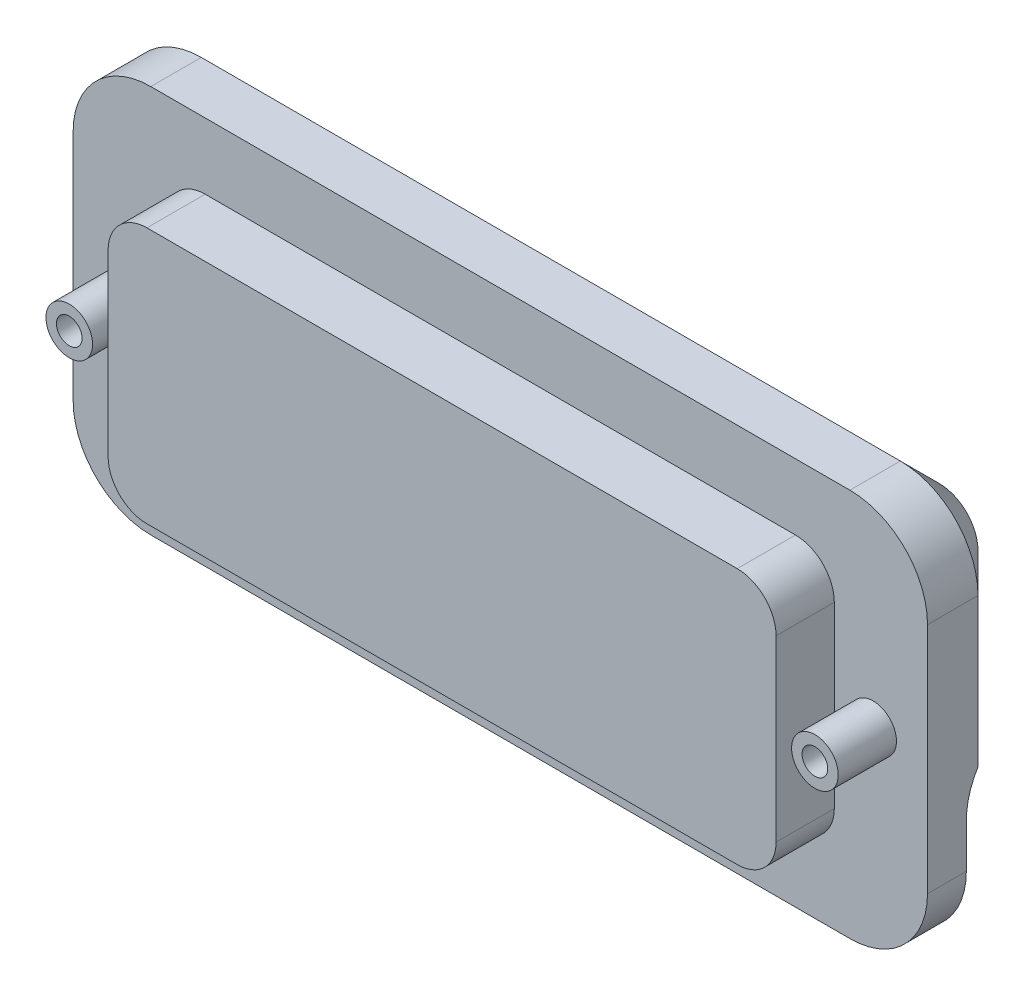
ISO-10303-21;
HEADER;
FILE_DESCRIPTION(('STEP AP214'),'2;1');
FILE_NAME('part.step','',(''),(''),'','','');
FILE_SCHEMA(('AUTOMOTIVE_DESIGN { 1 0 10303 214 1 1 1 1 }'));
ENDSEC;
DATA;
#1=APPLICATION_CONTEXT('core data for automotive mechanical design processes');
#2=APPLICATION_PROTOCOL_DEFINITION('international standard','automotive_design',2000,#1);
#3=PRODUCT_CONTEXT('',#1,'mechanical');
#4=PRODUCT('Part','Part','',(#3));
#5=PRODUCT_RELATED_PRODUCT_CATEGORY('part','',(#4));
#6=PRODUCT_DEFINITION_FORMATION('','',#4);
#7=PRODUCT_DEFINITION_CONTEXT('part definition',#1,'design');
#8=PRODUCT_DEFINITION('design','',#6,#7);
#9=PRODUCT_DEFINITION_SHAPE('','',#8);
#10=(LENGTH_UNIT() NAMED_UNIT(*) SI_UNIT(.MILLI.,.METRE.));
#11=(NAMED_UNIT(*) PLANE_ANGLE_UNIT() SI_UNIT($,.RADIAN.));
#12=(NAMED_UNIT(*) SI_UNIT($,.STERADIAN.) SOLID_ANGLE_UNIT());
#13=UNCERTAINTY_MEASURE_WITH_UNIT(LENGTH_MEASURE(1.E-05),#10,'distance_accuracy_value','');
#14=(GEOMETRIC_REPRESENTATION_CONTEXT(3) GLOBAL_UNCERTAINTY_ASSIGNED_CONTEXT((#13)) GLOBAL_UNIT_ASSIGNED_CONTEXT((#10,
#11,#12)) REPRESENTATION_CONTEXT('',''));
#15=CARTESIAN_POINT('',(0.,0.,0.));
#16=DIRECTION('',(0.,0.,1.));
#17=DIRECTION('',(1.,0.,0.));
#18=AXIS2_PLACEMENT_3D('',#15,#16,#17);
#19=CARTESIAN_POINT('',(0.,0.,0.));
#20=DIRECTION('',(0.,0.,1.));
#21=DIRECTION('',(1.,0.,0.));
#22=AXIS2_PLACEMENT_3D('',#19,#20,#21);
#23=PLANE('',#22);
#24=DIRECTION('',(0.,-1.,0.));
#25=VECTOR('',#24,1.);
#26=CARTESIAN_POINT('',(-55.,25.,0.));
#27=LINE('',#26,#25);
#28=CARTESIAN_POINT('',(-55.,-9.3674969975976,0.));
#29=VERTEX_POINT('',#28);
#30=CARTESIAN_POINT('',(-55.,-15.,0.));
#31=VERTEX_POINT('',#30);
#32=EDGE_CURVE('E292',#29,#31,#27,.T.);
#33=ORIENTED_EDGE('',*,*,#32,.F.);
#34=DIRECTION('',(1.,0.,0.));
#35=VECTOR('',#34,1.);
#36=CARTESIAN_POINT('',(0.,-9.3674969975976,0.));
#37=LINE('',#36,#35);
#38=CARTESIAN_POINT('',(55.,-9.3674969975976,0.));
#39=VERTEX_POINT('',#38);
#40=EDGE_CURVE('E347',#29,#39,#37,.T.);
#41=ORIENTED_EDGE('',*,*,#40,.T.);
#42=DIRECTION('',(0.,1.,0.));
#43=VECTOR('',#42,1.);
#44=CARTESIAN_POINT('',(55.,25.,0.));
#45=LINE('',#44,#43);
#46=CARTESIAN_POINT('',(55.,-15.,0.));
#47=VERTEX_POINT('',#46);
#48=EDGE_CURVE('E273',#47,#39,#45,.T.);
#49=ORIENTED_EDGE('',*,*,#48,.F.);
#50=CARTESIAN_POINT('',(45.,-15.,0.));
#51=DIRECTION('',(0.,0.,1.));
#52=DIRECTION('',(1.,0.,0.));
#53=AXIS2_PLACEMENT_3D('',#50,#51,#52);
#54=CIRCLE('',#53,10.);
#55=CARTESIAN_POINT('',(45.,-25.,0.));
#56=VERTEX_POINT('',#55);
#57=EDGE_CURVE('E316',#47,#56,#54,.F.);
#58=ORIENTED_EDGE('',*,*,#57,.T.);
#59=DIRECTION('',(1.,0.,0.));
#60=VECTOR('',#59,1.);
#61=CARTESIAN_POINT('',(-55.,-25.,0.));
#62=LINE('',#61,#60);
#63=CARTESIAN_POINT('',(-45.,-25.,0.));
#64=VERTEX_POINT('',#63);
#65=EDGE_CURVE('E280',#64,#56,#62,.T.);
#66=ORIENTED_EDGE('',*,*,#65,.F.);
#67=CARTESIAN_POINT('',(-45.,-15.,0.));
#68=DIRECTION('',(0.,0.,1.));
#69=DIRECTION('',(1.,0.,0.));
#70=AXIS2_PLACEMENT_3D('',#67,#68,#69);
#71=CIRCLE('',#70,10.);
#72=EDGE_CURVE('E313',#64,#31,#71,.F.);
#73=ORIENTED_EDGE('',*,*,#72,.T.);
#74=EDGE_LOOP('',(#33,#41,#49,#58,#66,#73));
#75=FACE_BOUND('',#74,.T.);
#76=ADVANCED_FACE('F36',(#75),#23,.F.);
#77=CARTESIAN_POINT('',(0.,0.,5.));
#78=DIRECTION('',(0.,0.,1.));
#79=DIRECTION('',(1.,0.,0.));
#80=AXIS2_PLACEMENT_3D('',#77,#78,#79);
#81=PLANE('',#80);
#82=CARTESIAN_POINT('',(48.,0.,5.));
#83=DIRECTION('',(0.,0.,1.));
#84=DIRECTION('',(1.,0.,0.));
#85=AXIS2_PLACEMENT_3D('',#82,#83,#84);
#86=CIRCLE('',#85,3.);
#87=CARTESIAN_POINT('',(51.,0.,5.));
#88=VERTEX_POINT('',#87);
#89=EDGE_CURVE('E263',#88,#88,#86,.T.);
#90=ORIENTED_EDGE('',*,*,#89,.F.);
#91=EDGE_LOOP('',(#90));
#92=FACE_BOUND('',#91,.T.);
#93=CARTESIAN_POINT('',(-48.,0.,5.));
#94=DIRECTION('',(0.,0.,1.));
#95=DIRECTION('',(1.,0.,0.));
#96=AXIS2_PLACEMENT_3D('',#93,#94,#95);
#97=CIRCLE('',#96,3.);
#98=CARTESIAN_POINT('',(-45.,0.,5.));
#99=VERTEX_POINT('',#98);
#100=EDGE_CURVE('E267',#99,#99,#97,.T.);
#101=ORIENTED_EDGE('',*,*,#100,.F.);
#102=EDGE_LOOP('',(#101));
#103=FACE_BOUND('',#102,.T.);
#104=DIRECTION('',(0.,1.,0.));
#105=VECTOR('',#104,1.);
#106=CARTESIAN_POINT('',(55.,25.,5.));
#107=LINE('',#106,#105);
#108=CARTESIAN_POINT('',(55.,-15.,5.));
#109=VERTEX_POINT('',#108);
#110=CARTESIAN_POINT('',(55.,15.,5.));
#111=VERTEX_POINT('',#110);
#112=EDGE_CURVE('E276',#109,#111,#107,.T.);
#113=ORIENTED_EDGE('',*,*,#112,.T.);
#114=CARTESIAN_POINT('',(45.,15.,5.));
#115=DIRECTION('',(0.,0.,1.));
#116=DIRECTION('',(1.,0.,0.));
#117=AXIS2_PLACEMENT_3D('',#114,#115,#116);
#118=CIRCLE('',#117,10.);
#119=CARTESIAN_POINT('',(45.,25.,5.));
#120=VERTEX_POINT('',#119);
#121=EDGE_CURVE('E311',#111,#120,#118,.T.);
#122=ORIENTED_EDGE('',*,*,#121,.T.);
#123=DIRECTION('',(-1.,0.,0.));
#124=VECTOR('',#123,1.);
#125=CARTESIAN_POINT('',(-55.,25.,5.));
#126=LINE('',#125,#124);
#127=CARTESIAN_POINT('',(-45.,25.,5.));
#128=VERTEX_POINT('',#127);
#129=EDGE_CURVE('E279',#120,#128,#126,.T.);
#130=ORIENTED_EDGE('',*,*,#129,.T.);
#131=CARTESIAN_POINT('',(-45.,15.,5.));
#132=DIRECTION('',(0.,0.,1.));
#133=DIRECTION('',(1.,0.,0.));
#134=AXIS2_PLACEMENT_3D('',#131,#132,#133);
#135=CIRCLE('',#134,10.);
#136=CARTESIAN_POINT('',(-55.,15.,5.));
#137=VERTEX_POINT('',#136);
#138=EDGE_CURVE('E305',#128,#137,#135,.T.);
#139=ORIENTED_EDGE('',*,*,#138,.T.);
#140=DIRECTION('',(0.,-1.,0.));
#141=VECTOR('',#140,1.);
#142=CARTESIAN_POINT('',(-55.,25.,5.));
#143=LINE('',#142,#141);
#144=CARTESIAN_POINT('',(-55.,-15.,5.));
#145=VERTEX_POINT('',#144);
#146=EDGE_CURVE('E283',#137,#145,#143,.T.);
#147=ORIENTED_EDGE('',*,*,#146,.T.);
#148=CARTESIAN_POINT('',(-45.,-15.,5.));
#149=DIRECTION('',(0.,0.,1.));
#150=DIRECTION('',(1.,0.,0.));
#151=AXIS2_PLACEMENT_3D('',#148,#149,#150);
#152=CIRCLE('',#151,10.);
#153=CARTESIAN_POINT('',(-45.,-25.,5.));
#154=VERTEX_POINT('',#153);
#155=EDGE_CURVE('E307',#145,#154,#152,.T.);
#156=ORIENTED_EDGE('',*,*,#155,.T.);
#157=DIRECTION('',(1.,0.,0.));
#158=VECTOR('',#157,1.);
#159=CARTESIAN_POINT('',(-55.,-25.,5.));
#160=LINE('',#159,#158);
#161=CARTESIAN_POINT('',(45.,-25.,5.));
#162=VERTEX_POINT('',#161);
#163=EDGE_CURVE('E286',#154,#162,#160,.T.);
#164=ORIENTED_EDGE('',*,*,#163,.T.);
#165=CARTESIAN_POINT('',(45.,-15.,5.));
#166=DIRECTION('',(0.,0.,1.));
#167=DIRECTION('',(1.,0.,0.));
#168=AXIS2_PLACEMENT_3D('',#165,#166,#167);
#169=CIRCLE('',#168,10.);
#170=EDGE_CURVE('E309',#162,#109,#169,.T.);
#171=ORIENTED_EDGE('',*,*,#170,.T.);
#172=EDGE_LOOP('',(#113,#122,#130,#139,#147,#156,#164,#171));
#173=FACE_BOUND('',#172,.T.);
#174=DIRECTION('',(0.,-1.,0.));
#175=VECTOR('',#174,1.);
#176=CARTESIAN_POINT('',(-43.,11.5,5.));
#177=LINE('',#176,#175);
#178=CARTESIAN_POINT('',(-43.,11.5,5.));
#179=VERTEX_POINT('',#178);
#180=CARTESIAN_POINT('',(-43.,-11.5,5.));
#181=VERTEX_POINT('',#180);
#182=EDGE_CURVE('E228',#179,#181,#177,.T.);
#183=ORIENTED_EDGE('',*,*,#182,.F.);
#184=CARTESIAN_POINT('',(-38.,11.5,5.));
#185=DIRECTION('',(0.,0.,1.));
#186=DIRECTION('',(1.,0.,0.));
#187=AXIS2_PLACEMENT_3D('',#184,#185,#186);
#188=CIRCLE('',#187,5.);
#189=CARTESIAN_POINT('',(-38.,16.5,5.));
#190=VERTEX_POINT('',#189);
#191=EDGE_CURVE('E206',#190,#179,#188,.T.);
#192=ORIENTED_EDGE('',*,*,#191,.F.);
#193=DIRECTION('',(-1.,0.,0.));
#194=VECTOR('',#193,1.);
#195=CARTESIAN_POINT('',(-38.,16.5,5.));
#196=LINE('',#195,#194);
#197=CARTESIAN_POINT('',(38.,16.5,5.));
#198=VERTEX_POINT('',#197);
#199=EDGE_CURVE('E211',#198,#190,#196,.T.);
#200=ORIENTED_EDGE('',*,*,#199,.F.);
#201=CARTESIAN_POINT('',(38.,11.5,5.));
#202=DIRECTION('',(0.,0.,1.));
#203=DIRECTION('',(-1.,0.,0.));
#204=AXIS2_PLACEMENT_3D('',#201,#202,#203);
#205=CIRCLE('',#204,5.);
#206=CARTESIAN_POINT('',(43.,11.5,5.));
#207=VERTEX_POINT('',#206);
#208=EDGE_CURVE('E238',#207,#198,#205,.T.);
#209=ORIENTED_EDGE('',*,*,#208,.F.);
#210=DIRECTION('',(0.,1.,0.));
#211=VECTOR('',#210,1.);
#212=CARTESIAN_POINT('',(43.,11.5,5.));
#213=LINE('',#212,#211);
#214=CARTESIAN_POINT('',(43.,-11.5,5.));
#215=VERTEX_POINT('',#214);
#216=EDGE_CURVE('E236',#215,#207,#213,.T.);
#217=ORIENTED_EDGE('',*,*,#216,.F.);
#218=CARTESIAN_POINT('',(38.,-11.5,5.));
#219=DIRECTION('',(0.,0.,1.));
#220=DIRECTION('',(-1.,0.,0.));
#221=AXIS2_PLACEMENT_3D('',#218,#219,#220);
#222=CIRCLE('',#221,5.);
#223=CARTESIAN_POINT('',(38.,-16.5,5.));
#224=VERTEX_POINT('',#223);
#225=EDGE_CURVE('E234',#224,#215,#222,.T.);
#226=ORIENTED_EDGE('',*,*,#225,.F.);
#227=DIRECTION('',(1.,0.,0.));
#228=VECTOR('',#227,1.);
#229=CARTESIAN_POINT('',(-38.,-16.5,5.));
#230=LINE('',#229,#228);
#231=CARTESIAN_POINT('',(-38.,-16.5,5.));
#232=VERTEX_POINT('',#231);
#233=EDGE_CURVE('E232',#232,#224,#230,.T.);
#234=ORIENTED_EDGE('',*,*,#233,.F.);
#235=CARTESIAN_POINT('',(-38.,-11.5,5.));
#236=DIRECTION('',(0.,0.,1.));
#237=DIRECTION('',(1.,0.,0.));
#238=AXIS2_PLACEMENT_3D('',#235,#236,#237);
#239=CIRCLE('',#238,5.);
#240=EDGE_CURVE('E230',#181,#232,#239,.T.);
#241=ORIENTED_EDGE('',*,*,#240,.F.);
#242=EDGE_LOOP('',(#183,#192,#200,#209,#217,#226,#234,#241));
#243=FACE_BOUND('',#242,.T.);
#244=ADVANCED_FACE('F400',(#92,#103,#173,#243),#81,.T.);
#245=CARTESIAN_POINT('',(55.,25.,5.));
#246=DIRECTION('',(-1.,0.,0.));
#247=DIRECTION('',(0.,-1.,0.));
#248=AXIS2_PLACEMENT_3D('',#245,#246,#247);
#249=PLANE('',#248);
#250=ORIENTED_EDGE('',*,*,#48,.T.);
#251=CARTESIAN_POINT('',(55.,-9.3674969975976,-10.));
#252=DIRECTION('',(-1.,0.,0.));
#253=DIRECTION('',(0.,-1.,0.));
#254=AXIS2_PLACEMENT_3D('',#251,#252,#253);
#255=CIRCLE('',#254,10.);
#256=CARTESIAN_POINT('',(55.,-4.09967012117008,-1.49999999999997));
#257=VERTEX_POINT('',#256);
#258=EDGE_CURVE('E44',#39,#257,#255,.T.);
#259=ORIENTED_EDGE('',*,*,#258,.T.);
#260=DIRECTION('',(0.,1.,0.));
#261=VECTOR('',#260,1.);
#262=CARTESIAN_POINT('',(55.,25.,-1.49999999999997));
#263=LINE('',#262,#261);
#264=CARTESIAN_POINT('',(55.,15.,-1.49999999999997));
#265=VERTEX_POINT('',#264);
#266=EDGE_CURVE('E50',#257,#265,#263,.T.);
#267=ORIENTED_EDGE('',*,*,#266,.T.);
#268=DIRECTION('',(0.,0.,-1.));
#269=VECTOR('',#268,1.);
#270=CARTESIAN_POINT('',(55.,15.,5.));
#271=LINE('',#270,#269);
#272=EDGE_CURVE('E303',#265,#111,#271,.F.);
#273=ORIENTED_EDGE('',*,*,#272,.T.);
#274=ORIENTED_EDGE('',*,*,#112,.F.);
#275=DIRECTION('',(0.,0.,-1.));
#276=VECTOR('',#275,1.);
#277=CARTESIAN_POINT('',(55.,-15.,5.));
#278=LINE('',#277,#276);
#279=EDGE_CURVE('E300',#109,#47,#278,.T.);
#280=ORIENTED_EDGE('',*,*,#279,.T.);
#281=EDGE_LOOP('',(#250,#259,#267,#273,#274,#280));
#282=FACE_BOUND('',#281,.T.);
#283=ADVANCED_FACE('F366',(#282),#249,.F.);
#284=CARTESIAN_POINT('',(-55.,25.,5.));
#285=DIRECTION('',(0.,-1.,0.));
#286=DIRECTION('',(0.,0.,-1.));
#287=AXIS2_PLACEMENT_3D('',#284,#285,#286);
#288=PLANE('',#287);
#289=DIRECTION('',(0.,0.,-1.));
#290=VECTOR('',#289,1.);
#291=CARTESIAN_POINT('',(45.,25.,5.));
#292=LINE('',#291,#290);
#293=CARTESIAN_POINT('',(45.,25.,-1.49999999999997));
#294=VERTEX_POINT('',#293);
#295=EDGE_CURVE('E297',#120,#294,#292,.T.);
#296=ORIENTED_EDGE('',*,*,#295,.T.);
#297=DIRECTION('',(-1.,0.,0.));
#298=VECTOR('',#297,1.);
#299=CARTESIAN_POINT('',(-55.,25.,-1.49999999999997));
#300=LINE('',#299,#298);
#301=CARTESIAN_POINT('',(-45.,25.,-1.49999999999997));
#302=VERTEX_POINT('',#301);
#303=EDGE_CURVE('E345',#294,#302,#300,.T.);
#304=ORIENTED_EDGE('',*,*,#303,.T.);
#305=DIRECTION('',(0.,0.,-1.));
#306=VECTOR('',#305,1.);
#307=CARTESIAN_POINT('',(-45.,25.,5.));
#308=LINE('',#307,#306);
#309=EDGE_CURVE('E289',#302,#128,#308,.F.);
#310=ORIENTED_EDGE('',*,*,#309,.T.);
#311=ORIENTED_EDGE('',*,*,#129,.F.);
#312=EDGE_LOOP('',(#296,#304,#310,#311));
#313=FACE_BOUND('',#312,.T.);
#314=ADVANCED_FACE('F391',(#313),#288,.F.);
#315=CARTESIAN_POINT('',(-55.,25.,5.));
#316=DIRECTION('',(1.,0.,0.));
#317=DIRECTION('',(0.,1.,0.));
#318=AXIS2_PLACEMENT_3D('',#315,#316,#317);
#319=PLANE('',#318);
#320=DIRECTION('',(0.,0.,-1.));
#321=VECTOR('',#320,1.);
#322=CARTESIAN_POINT('',(-55.,15.,5.));
#323=LINE('',#322,#321);
#324=CARTESIAN_POINT('',(-55.,15.,-1.49999999999997));
#325=VERTEX_POINT('',#324);
#326=EDGE_CURVE('E323',#137,#325,#323,.T.);
#327=ORIENTED_EDGE('',*,*,#326,.T.);
#328=DIRECTION('',(0.,-1.,0.));
#329=VECTOR('',#328,1.);
#330=CARTESIAN_POINT('',(-55.,25.,-1.49999999999997));
#331=LINE('',#330,#329);
#332=CARTESIAN_POINT('',(-55.,-4.09967012117007,-1.49999999999997));
#333=VERTEX_POINT('',#332);
#334=EDGE_CURVE('E58',#325,#333,#331,.T.);
#335=ORIENTED_EDGE('',*,*,#334,.T.);
#336=CARTESIAN_POINT('',(-55.,-9.3674969975976,-10.));
#337=DIRECTION('',(1.,0.,0.));
#338=DIRECTION('',(0.,1.,0.));
#339=AXIS2_PLACEMENT_3D('',#336,#337,#338);
#340=CIRCLE('',#339,10.);
#341=EDGE_CURVE('E362',#333,#29,#340,.T.);
#342=ORIENTED_EDGE('',*,*,#341,.T.);
#343=ORIENTED_EDGE('',*,*,#32,.T.);
#344=DIRECTION('',(0.,0.,-1.));
#345=VECTOR('',#344,1.);
#346=CARTESIAN_POINT('',(-55.,-15.,5.));
#347=LINE('',#346,#345);
#348=EDGE_CURVE('E325',#31,#145,#347,.F.);
#349=ORIENTED_EDGE('',*,*,#348,.T.);
#350=ORIENTED_EDGE('',*,*,#146,.F.);
#351=EDGE_LOOP('',(#327,#335,#342,#343,#349,#350));
#352=FACE_BOUND('',#351,.T.);
#353=ADVANCED_FACE('F403',(#352),#319,.F.);
#354=CARTESIAN_POINT('',(-55.,-25.,5.));
#355=DIRECTION('',(0.,1.,0.));
#356=DIRECTION('',(0.,0.,1.));
#357=AXIS2_PLACEMENT_3D('',#354,#355,#356);
#358=PLANE('',#357);
#359=ORIENTED_EDGE('',*,*,#65,.T.);
#360=DIRECTION('',(0.,0.,-1.));
#361=VECTOR('',#360,1.);
#362=CARTESIAN_POINT('',(45.,-25.,5.));
#363=LINE('',#362,#361);
#364=EDGE_CURVE('E321',#56,#162,#363,.F.);
#365=ORIENTED_EDGE('',*,*,#364,.T.);
#366=ORIENTED_EDGE('',*,*,#163,.F.);
#367=DIRECTION('',(0.,0.,-1.));
#368=VECTOR('',#367,1.);
#369=CARTESIAN_POINT('',(-45.,-25.,5.));
#370=LINE('',#369,#368);
#371=EDGE_CURVE('E318',#154,#64,#370,.T.);
#372=ORIENTED_EDGE('',*,*,#371,.T.);
#373=EDGE_LOOP('',(#359,#365,#366,#372));
#374=FACE_BOUND('',#373,.T.);
#375=ADVANCED_FACE('F412',(#374),#358,.F.);
#376=CARTESIAN_POINT('',(-48.,0.,12.5));
#377=DIRECTION('',(0.,0.,-1.));
#378=DIRECTION('',(-1.,0.,0.));
#379=AXIS2_PLACEMENT_3D('',#376,#377,#378);
#380=CYLINDRICAL_SURFACE('',#379,3.);
#381=CARTESIAN_POINT('',(-48.,0.,12.5));
#382=DIRECTION('',(0.,0.,1.));
#383=DIRECTION('',(1.,0.,0.));
#384=AXIS2_PLACEMENT_3D('',#381,#382,#383);
#385=CIRCLE('',#384,3.);
#386=CARTESIAN_POINT('',(-45.,0.,12.5));
#387=VERTEX_POINT('',#386);
#388=EDGE_CURVE('E270',#387,#387,#385,.T.);
#389=ORIENTED_EDGE('',*,*,#388,.F.);
#390=EDGE_LOOP('',(#389));
#391=FACE_BOUND('',#390,.T.);
#392=ORIENTED_EDGE('',*,*,#100,.T.);
#393=EDGE_LOOP('',(#392));
#394=FACE_BOUND('',#393,.T.);
#395=ADVANCED_FACE('F443',(#391,#394),#380,.T.);
#396=CARTESIAN_POINT('',(-48.,0.,12.5));
#397=DIRECTION('',(0.,0.,1.));
#398=DIRECTION('',(1.,0.,0.));
#399=AXIS2_PLACEMENT_3D('',#396,#397,#398);
#400=PLANE('',#399);
#401=CARTESIAN_POINT('',(-48.,0.,12.5));
#402=DIRECTION('',(0.,0.,1.));
#403=DIRECTION('',(1.,0.,0.));
#404=AXIS2_PLACEMENT_3D('',#401,#402,#403);
#405=CIRCLE('',#404,1.64999999999999);
#406=CARTESIAN_POINT('',(-46.35,0.,12.5));
#407=VERTEX_POINT('',#406);
#408=EDGE_CURVE('E193',#407,#407,#405,.T.);
#409=ORIENTED_EDGE('',*,*,#408,.F.);
#410=EDGE_LOOP('',(#409));
#411=FACE_BOUND('',#410,.T.);
#412=ORIENTED_EDGE('',*,*,#388,.T.);
#413=EDGE_LOOP('',(#412));
#414=FACE_BOUND('',#413,.T.);
#415=ADVANCED_FACE('F473',(#411,#414),#400,.T.);
#416=CARTESIAN_POINT('',(48.,0.,12.5));
#417=DIRECTION('',(0.,0.,-1.));
#418=DIRECTION('',(-1.,0.,0.));
#419=AXIS2_PLACEMENT_3D('',#416,#417,#418);
#420=CYLINDRICAL_SURFACE('',#419,3.);
#421=CARTESIAN_POINT('',(48.,0.,12.5));
#422=DIRECTION('',(0.,0.,1.));
#423=DIRECTION('',(1.,0.,0.));
#424=AXIS2_PLACEMENT_3D('',#421,#422,#423);
#425=CIRCLE('',#424,3.);
#426=CARTESIAN_POINT('',(51.,0.,12.5));
#427=VERTEX_POINT('',#426);
#428=EDGE_CURVE('E264',#427,#427,#425,.T.);
#429=ORIENTED_EDGE('',*,*,#428,.F.);
#430=EDGE_LOOP('',(#429));
#431=FACE_BOUND('',#430,.T.);
#432=ORIENTED_EDGE('',*,*,#89,.T.);
#433=EDGE_LOOP('',(#432));
#434=FACE_BOUND('',#433,.T.);
#435=ADVANCED_FACE('F481',(#431,#434),#420,.T.);
#436=CARTESIAN_POINT('',(48.,0.,12.5));
#437=DIRECTION('',(0.,0.,1.));
#438=DIRECTION('',(1.,0.,0.));
#439=AXIS2_PLACEMENT_3D('',#436,#437,#438);
#440=PLANE('',#439);
#441=CARTESIAN_POINT('',(48.,0.,12.5));
#442=DIRECTION('',(0.,0.,1.));
#443=DIRECTION('',(1.,0.,0.));
#444=AXIS2_PLACEMENT_3D('',#441,#442,#443);
#445=CIRCLE('',#444,1.64999999999999);
#446=CARTESIAN_POINT('',(49.65,0.,12.5));
#447=VERTEX_POINT('',#446);
#448=EDGE_CURVE('E194',#447,#447,#445,.T.);
#449=ORIENTED_EDGE('',*,*,#448,.F.);
#450=EDGE_LOOP('',(#449));
#451=FACE_BOUND('',#450,.T.);
#452=ORIENTED_EDGE('',*,*,#428,.T.);
#453=EDGE_LOOP('',(#452));
#454=FACE_BOUND('',#453,.T.);
#455=ADVANCED_FACE('F490',(#451,#454),#440,.T.);
#456=CARTESIAN_POINT('',(-38.,11.5,12.5));
#457=DIRECTION('',(0.,0.,-1.));
#458=DIRECTION('',(-1.,0.,0.));
#459=AXIS2_PLACEMENT_3D('',#456,#457,#458);
#460=CYLINDRICAL_SURFACE('',#459,5.);
#461=ORIENTED_EDGE('',*,*,#191,.T.);
#462=DIRECTION('',(0.,0.,-1.));
#463=VECTOR('',#462,1.);
#464=CARTESIAN_POINT('',(-43.,11.5,12.5));
#465=LINE('',#464,#463);
#466=CARTESIAN_POINT('',(-43.,11.5,12.5));
#467=VERTEX_POINT('',#466);
#468=EDGE_CURVE('E261',#467,#179,#465,.T.);
#469=ORIENTED_EDGE('',*,*,#468,.F.);
#470=CARTESIAN_POINT('',(-38.,11.5,12.5));
#471=DIRECTION('',(0.,0.,1.));
#472=DIRECTION('',(1.,0.,0.));
#473=AXIS2_PLACEMENT_3D('',#470,#471,#472);
#474=CIRCLE('',#473,5.);
#475=CARTESIAN_POINT('',(-38.,16.5,12.5));
#476=VERTEX_POINT('',#475);
#477=EDGE_CURVE('E207',#476,#467,#474,.T.);
#478=ORIENTED_EDGE('',*,*,#477,.F.);
#479=DIRECTION('',(0.,0.,-1.));
#480=VECTOR('',#479,1.);
#481=CARTESIAN_POINT('',(-38.,16.5,12.5));
#482=LINE('',#481,#480);
#483=EDGE_CURVE('E225',#476,#190,#482,.T.);
#484=ORIENTED_EDGE('',*,*,#483,.T.);
#485=EDGE_LOOP('',(#461,#469,#478,#484));
#486=FACE_BOUND('',#485,.T.);
#487=ADVANCED_FACE('F498',(#486),#460,.T.);
#488=CARTESIAN_POINT('',(-43.,11.5,12.5));
#489=DIRECTION('',(1.,0.,0.));
#490=DIRECTION('',(0.,1.,0.));
#491=AXIS2_PLACEMENT_3D('',#488,#489,#490);
#492=PLANE('',#491);
#493=ORIENTED_EDGE('',*,*,#182,.T.);
#494=DIRECTION('',(0.,0.,-1.));
#495=VECTOR('',#494,1.);
#496=CARTESIAN_POINT('',(-43.,-11.5,12.5));
#497=LINE('',#496,#495);
#498=CARTESIAN_POINT('',(-43.,-11.5,12.5));
#499=VERTEX_POINT('',#498);
#500=EDGE_CURVE('E258',#499,#181,#497,.T.);
#501=ORIENTED_EDGE('',*,*,#500,.F.);
#502=DIRECTION('',(0.,-1.,0.));
#503=VECTOR('',#502,1.);
#504=CARTESIAN_POINT('',(-43.,11.5,12.5));
#505=LINE('',#504,#503);
#506=EDGE_CURVE('E210',#467,#499,#505,.T.);
#507=ORIENTED_EDGE('',*,*,#506,.F.);
#508=ORIENTED_EDGE('',*,*,#468,.T.);
#509=EDGE_LOOP('',(#493,#501,#507,#508));
#510=FACE_BOUND('',#509,.T.);
#511=ADVANCED_FACE('F506',(#510),#492,.F.);
#512=CARTESIAN_POINT('',(-38.,-11.5,12.5));
#513=DIRECTION('',(0.,0.,-1.));
#514=DIRECTION('',(-1.,0.,0.));
#515=AXIS2_PLACEMENT_3D('',#512,#513,#514);
#516=CYLINDRICAL_SURFACE('',#515,5.);
#517=ORIENTED_EDGE('',*,*,#240,.T.);
#518=DIRECTION('',(0.,0.,-1.));
#519=VECTOR('',#518,1.);
#520=CARTESIAN_POINT('',(-38.,-16.5,12.5));
#521=LINE('',#520,#519);
#522=CARTESIAN_POINT('',(-38.,-16.5,12.5));
#523=VERTEX_POINT('',#522);
#524=EDGE_CURVE('E255',#523,#232,#521,.T.);
#525=ORIENTED_EDGE('',*,*,#524,.F.);
#526=CARTESIAN_POINT('',(-38.,-11.5,12.5));
#527=DIRECTION('',(0.,0.,1.));
#528=DIRECTION('',(1.,0.,0.));
#529=AXIS2_PLACEMENT_3D('',#526,#527,#528);
#530=CIRCLE('',#529,5.);
#531=EDGE_CURVE('E213',#499,#523,#530,.T.);
#532=ORIENTED_EDGE('',*,*,#531,.F.);
#533=ORIENTED_EDGE('',*,*,#500,.T.);
#534=EDGE_LOOP('',(#517,#525,#532,#533));
#535=FACE_BOUND('',#534,.T.);
#536=ADVANCED_FACE('F514',(#535),#516,.T.);
#537=CARTESIAN_POINT('',(-38.,-16.5,12.5));
#538=DIRECTION('',(0.,1.,0.));
#539=DIRECTION('',(0.,0.,1.));
#540=AXIS2_PLACEMENT_3D('',#537,#538,#539);
#541=PLANE('',#540);
#542=ORIENTED_EDGE('',*,*,#233,.T.);
#543=DIRECTION('',(0.,0.,-1.));
#544=VECTOR('',#543,1.);
#545=CARTESIAN_POINT('',(38.,-16.5,12.5));
#546=LINE('',#545,#544);
#547=CARTESIAN_POINT('',(38.,-16.5,12.5));
#548=VERTEX_POINT('',#547);
#549=EDGE_CURVE('E252',#548,#224,#546,.T.);
#550=ORIENTED_EDGE('',*,*,#549,.F.);
#551=DIRECTION('',(1.,0.,0.));
#552=VECTOR('',#551,1.);
#553=CARTESIAN_POINT('',(-38.,-16.5,12.5));
#554=LINE('',#553,#552);
#555=EDGE_CURVE('E215',#523,#548,#554,.T.);
#556=ORIENTED_EDGE('',*,*,#555,.F.);
#557=ORIENTED_EDGE('',*,*,#524,.T.);
#558=EDGE_LOOP('',(#542,#550,#556,#557));
#559=FACE_BOUND('',#558,.T.);
#560=ADVANCED_FACE('F522',(#559),#541,.F.);
#561=CARTESIAN_POINT('',(38.,-11.5,12.5));
#562=DIRECTION('',(0.,0.,-1.));
#563=DIRECTION('',(-1.,0.,0.));
#564=AXIS2_PLACEMENT_3D('',#561,#562,#563);
#565=CYLINDRICAL_SURFACE('',#564,5.);
#566=ORIENTED_EDGE('',*,*,#225,.T.);
#567=DIRECTION('',(0.,0.,-1.));
#568=VECTOR('',#567,1.);
#569=CARTESIAN_POINT('',(43.,-11.5,12.5));
#570=LINE('',#569,#568);
#571=CARTESIAN_POINT('',(43.,-11.5,12.5));
#572=VERTEX_POINT('',#571);
#573=EDGE_CURVE('E249',#572,#215,#570,.T.);
#574=ORIENTED_EDGE('',*,*,#573,.F.);
#575=CARTESIAN_POINT('',(38.,-11.5,12.5));
#576=DIRECTION('',(0.,0.,1.));
#577=DIRECTION('',(-1.,0.,0.));
#578=AXIS2_PLACEMENT_3D('',#575,#576,#577);
#579=CIRCLE('',#578,5.);
#580=EDGE_CURVE('E217',#548,#572,#579,.T.);
#581=ORIENTED_EDGE('',*,*,#580,.F.);
#582=ORIENTED_EDGE('',*,*,#549,.T.);
#583=EDGE_LOOP('',(#566,#574,#581,#582));
#584=FACE_BOUND('',#583,.T.);
#585=ADVANCED_FACE('F530',(#584),#565,.T.);
#586=CARTESIAN_POINT('',(43.,11.5,12.5));
#587=DIRECTION('',(-1.,0.,0.));
#588=DIRECTION('',(0.,-1.,0.));
#589=AXIS2_PLACEMENT_3D('',#586,#587,#588);
#590=PLANE('',#589);
#591=ORIENTED_EDGE('',*,*,#216,.T.);
#592=DIRECTION('',(0.,0.,-1.));
#593=VECTOR('',#592,1.);
#594=CARTESIAN_POINT('',(43.,11.5,12.5));
#595=LINE('',#594,#593);
#596=CARTESIAN_POINT('',(43.,11.5,12.5));
#597=VERTEX_POINT('',#596);
#598=EDGE_CURVE('E246',#597,#207,#595,.T.);
#599=ORIENTED_EDGE('',*,*,#598,.F.);
#600=DIRECTION('',(0.,1.,0.));
#601=VECTOR('',#600,1.);
#602=CARTESIAN_POINT('',(43.,11.5,12.5));
#603=LINE('',#602,#601);
#604=EDGE_CURVE('E219',#572,#597,#603,.T.);
#605=ORIENTED_EDGE('',*,*,#604,.F.);
#606=ORIENTED_EDGE('',*,*,#573,.T.);
#607=EDGE_LOOP('',(#591,#599,#605,#606));
#608=FACE_BOUND('',#607,.T.);
#609=ADVANCED_FACE('F538',(#608),#590,.F.);
#610=CARTESIAN_POINT('',(38.,11.5,12.5));
#611=DIRECTION('',(0.,0.,-1.));
#612=DIRECTION('',(-1.,0.,0.));
#613=AXIS2_PLACEMENT_3D('',#610,#611,#612);
#614=CYLINDRICAL_SURFACE('',#613,5.);
#615=ORIENTED_EDGE('',*,*,#208,.T.);
#616=DIRECTION('',(0.,0.,-1.));
#617=VECTOR('',#616,1.);
#618=CARTESIAN_POINT('',(38.,16.5,12.5));
#619=LINE('',#618,#617);
#620=CARTESIAN_POINT('',(38.,16.5,12.5));
#621=VERTEX_POINT('',#620);
#622=EDGE_CURVE('E244',#621,#198,#619,.T.);
#623=ORIENTED_EDGE('',*,*,#622,.F.);
#624=CARTESIAN_POINT('',(38.,11.5,12.5));
#625=DIRECTION('',(0.,0.,1.));
#626=DIRECTION('',(-1.,0.,0.));
#627=AXIS2_PLACEMENT_3D('',#624,#625,#626);
#628=CIRCLE('',#627,5.);
#629=EDGE_CURVE('E221',#597,#621,#628,.T.);
#630=ORIENTED_EDGE('',*,*,#629,.F.);
#631=ORIENTED_EDGE('',*,*,#598,.T.);
#632=EDGE_LOOP('',(#615,#623,#630,#631));
#633=FACE_BOUND('',#632,.T.);
#634=ADVANCED_FACE('F546',(#633),#614,.T.);
#635=CARTESIAN_POINT('',(-38.,16.5,12.5));
#636=DIRECTION('',(0.,-1.,0.));
#637=DIRECTION('',(0.,0.,-1.));
#638=AXIS2_PLACEMENT_3D('',#635,#636,#637);
#639=PLANE('',#638);
#640=ORIENTED_EDGE('',*,*,#199,.T.);
#641=ORIENTED_EDGE('',*,*,#483,.F.);
#642=DIRECTION('',(-1.,0.,0.));
#643=VECTOR('',#642,1.);
#644=CARTESIAN_POINT('',(-38.,16.5,12.5));
#645=LINE('',#644,#643);
#646=EDGE_CURVE('E223',#621,#476,#645,.T.);
#647=ORIENTED_EDGE('',*,*,#646,.F.);
#648=ORIENTED_EDGE('',*,*,#622,.T.);
#649=EDGE_LOOP('',(#640,#641,#647,#648));
#650=FACE_BOUND('',#649,.T.);
#651=ADVANCED_FACE('F554',(#650),#639,.F.);
#652=CARTESIAN_POINT('',(-38.,11.5,12.5));
#653=DIRECTION('',(0.,0.,1.));
#654=DIRECTION('',(1.,0.,0.));
#655=AXIS2_PLACEMENT_3D('',#652,#653,#654);
#656=PLANE('',#655);
#657=ORIENTED_EDGE('',*,*,#477,.T.);
#658=ORIENTED_EDGE('',*,*,#506,.T.);
#659=ORIENTED_EDGE('',*,*,#531,.T.);
#660=ORIENTED_EDGE('',*,*,#555,.T.);
#661=ORIENTED_EDGE('',*,*,#580,.T.);
#662=ORIENTED_EDGE('',*,*,#604,.T.);
#663=ORIENTED_EDGE('',*,*,#629,.T.);
#664=ORIENTED_EDGE('',*,*,#646,.T.);
#665=EDGE_LOOP('',(#657,#658,#659,#660,#661,#662,#663,#664));
#666=FACE_BOUND('',#665,.T.);
#667=ADVANCED_FACE('F562',(#666),#656,.T.);
#668=CARTESIAN_POINT('',(-48.,0.,7.5));
#669=DIRECTION('',(0.,0.,1.));
#670=DIRECTION('',(1.,0.,0.));
#671=AXIS2_PLACEMENT_3D('',#668,#669,#670);
#672=CONICAL_SURFACE('',#671,1.65,1.02974425867665);
#673=CARTESIAN_POINT('',(-48.,0.,6.50857997860453));
#674=VERTEX_POINT('',#673);
#675=VERTEX_LOOP('',#674);
#676=FACE_BOUND('',#675,.T.);
#677=CARTESIAN_POINT('',(-48.,0.,7.5));
#678=DIRECTION('',(0.,0.,1.));
#679=DIRECTION('',(1.,0.,0.));
#680=AXIS2_PLACEMENT_3D('',#677,#678,#679);
#681=CIRCLE('',#680,1.65);
#682=CARTESIAN_POINT('',(-46.35,0.,7.5));
#683=VERTEX_POINT('',#682);
#684=EDGE_CURVE('E197',#683,#683,#681,.T.);
#685=ORIENTED_EDGE('',*,*,#684,.T.);
#686=EDGE_LOOP('',(#685));
#687=FACE_BOUND('',#686,.T.);
#688=ADVANCED_FACE('F569',(#676,#687),#672,.F.);
#689=CARTESIAN_POINT('',(-48.,0.,12.5));
#690=DIRECTION('',(0.,0.,1.));
#691=DIRECTION('',(1.,0.,0.));
#692=AXIS2_PLACEMENT_3D('',#689,#690,#691);
#693=CYLINDRICAL_SURFACE('',#692,1.65);
#694=ORIENTED_EDGE('',*,*,#684,.F.);
#695=EDGE_LOOP('',(#694));
#696=FACE_BOUND('',#695,.T.);
#697=ORIENTED_EDGE('',*,*,#408,.T.);
#698=EDGE_LOOP('',(#697));
#699=FACE_BOUND('',#698,.T.);
#700=ADVANCED_FACE('F187',(#696,#699),#693,.F.);
#701=CARTESIAN_POINT('',(48.,0.,7.5));
#702=DIRECTION('',(0.,0.,1.));
#703=DIRECTION('',(1.,0.,0.));
#704=AXIS2_PLACEMENT_3D('',#701,#702,#703);
#705=CONICAL_SURFACE('',#704,1.65,1.02974425867665);
#706=CARTESIAN_POINT('',(48.,0.,6.50857997860453));
#707=VERTEX_POINT('',#706);
#708=VERTEX_LOOP('',#707);
#709=FACE_BOUND('',#708,.T.);
#710=CARTESIAN_POINT('',(48.,0.,7.5));
#711=DIRECTION('',(0.,0.,1.));
#712=DIRECTION('',(1.,0.,0.));
#713=AXIS2_PLACEMENT_3D('',#710,#711,#712);
#714=CIRCLE('',#713,1.65);
#715=CARTESIAN_POINT('',(49.65,0.,7.5));
#716=VERTEX_POINT('',#715);
#717=EDGE_CURVE('E191',#716,#716,#714,.T.);
#718=ORIENTED_EDGE('',*,*,#717,.T.);
#719=EDGE_LOOP('',(#718));
#720=FACE_BOUND('',#719,.T.);
#721=ADVANCED_FACE('F183',(#709,#720),#705,.F.);
#722=CARTESIAN_POINT('',(48.,0.,12.5));
#723=DIRECTION('',(0.,0.,1.));
#724=DIRECTION('',(1.,0.,0.));
#725=AXIS2_PLACEMENT_3D('',#722,#723,#724);
#726=CYLINDRICAL_SURFACE('',#725,1.65);
#727=ORIENTED_EDGE('',*,*,#717,.F.);
#728=EDGE_LOOP('',(#727));
#729=FACE_BOUND('',#728,.T.);
#730=ORIENTED_EDGE('',*,*,#448,.T.);
#731=EDGE_LOOP('',(#730));
#732=FACE_BOUND('',#731,.T.);
#733=ADVANCED_FACE('F186',(#729,#732),#726,.F.);
#734=CARTESIAN_POINT('',(0.,0.,-6.5));
#735=DIRECTION('',(0.,0.,1.));
#736=DIRECTION('',(1.,0.,0.));
#737=AXIS2_PLACEMENT_3D('',#734,#735,#736);
#738=PLANE('',#737);
#739=DIRECTION('',(-1.,0.,0.));
#740=VECTOR('',#739,1.);
#741=CARTESIAN_POINT('',(-55.,0.,-6.5));
#742=LINE('',#741,#740);
#743=CARTESIAN_POINT('',(50.,0.,-6.5));
#744=VERTEX_POINT('',#743);
#745=CARTESIAN_POINT('',(-50.,0.,-6.5));
#746=VERTEX_POINT('',#745);
#747=EDGE_CURVE('E200',#744,#746,#742,.T.);
#748=ORIENTED_EDGE('',*,*,#747,.T.);
#749=DIRECTION('',(0.,1.,0.));
#750=VECTOR('',#749,1.);
#751=CARTESIAN_POINT('',(-50.,0.,-6.5));
#752=LINE('',#751,#750);
#753=CARTESIAN_POINT('',(-50.,15.,-6.5));
#754=VERTEX_POINT('',#753);
#755=EDGE_CURVE('E336',#746,#754,#752,.T.);
#756=ORIENTED_EDGE('',*,*,#755,.T.);
#757=CARTESIAN_POINT('',(-45.,15.,-6.5));
#758=DIRECTION('',(0.,0.,1.));
#759=DIRECTION('',(1.,0.,0.));
#760=AXIS2_PLACEMENT_3D('',#757,#758,#759);
#761=CIRCLE('',#760,4.99999999999997);
#762=CARTESIAN_POINT('',(-45.,20.,-6.5));
#763=VERTEX_POINT('',#762);
#764=EDGE_CURVE('E331',#754,#763,#761,.F.);
#765=ORIENTED_EDGE('',*,*,#764,.T.);
#766=DIRECTION('',(1.,0.,0.));
#767=VECTOR('',#766,1.);
#768=CARTESIAN_POINT('',(0.,20.,-6.5));
#769=LINE('',#768,#767);
#770=CARTESIAN_POINT('',(45.,20.,-6.5));
#771=VERTEX_POINT('',#770);
#772=EDGE_CURVE('E327',#763,#771,#769,.T.);
#773=ORIENTED_EDGE('',*,*,#772,.T.);
#774=CARTESIAN_POINT('',(45.,15.,-6.5));
#775=DIRECTION('',(0.,0.,1.));
#776=DIRECTION('',(1.,0.,0.));
#777=AXIS2_PLACEMENT_3D('',#774,#775,#776);
#778=CIRCLE('',#777,4.99999999999997);
#779=CARTESIAN_POINT('',(50.,15.,-6.5));
#780=VERTEX_POINT('',#779);
#781=EDGE_CURVE('E329',#771,#780,#778,.F.);
#782=ORIENTED_EDGE('',*,*,#781,.T.);
#783=DIRECTION('',(0.,-1.,0.));
#784=VECTOR('',#783,1.);
#785=CARTESIAN_POINT('',(50.,0.,-6.5));
#786=LINE('',#785,#784);
#787=EDGE_CURVE('E333',#780,#744,#786,.T.);
#788=ORIENTED_EDGE('',*,*,#787,.T.);
#789=EDGE_LOOP('',(#748,#756,#765,#773,#782,#788));
#790=FACE_BOUND('',#789,.T.);
#791=ADVANCED_FACE('F376',(#790),#738,.F.);
#792=CARTESIAN_POINT('',(45.,15.,5.));
#793=DIRECTION('',(0.,0.,-1.));
#794=DIRECTION('',(-1.,0.,0.));
#795=AXIS2_PLACEMENT_3D('',#792,#793,#794);
#796=CYLINDRICAL_SURFACE('',#795,10.);
#797=ORIENTED_EDGE('',*,*,#272,.F.);
#798=CARTESIAN_POINT('',(45.,15.,-1.49999999999997));
#799=DIRECTION('',(0.,0.,1.));
#800=DIRECTION('',(1.,0.,0.));
#801=AXIS2_PLACEMENT_3D('',#798,#799,#800);
#802=CIRCLE('',#801,10.);
#803=EDGE_CURVE('E343',#265,#294,#802,.T.);
#804=ORIENTED_EDGE('',*,*,#803,.T.);
#805=ORIENTED_EDGE('',*,*,#295,.F.);
#806=ORIENTED_EDGE('',*,*,#121,.F.);
#807=EDGE_LOOP('',(#797,#804,#805,#806));
#808=FACE_BOUND('',#807,.T.);
#809=ADVANCED_FACE('F421',(#808),#796,.T.);
#810=CARTESIAN_POINT('',(45.,-15.,5.));
#811=DIRECTION('',(0.,0.,-1.));
#812=DIRECTION('',(-1.,0.,0.));
#813=AXIS2_PLACEMENT_3D('',#810,#811,#812);
#814=CYLINDRICAL_SURFACE('',#813,10.);
#815=ORIENTED_EDGE('',*,*,#170,.F.);
#816=ORIENTED_EDGE('',*,*,#364,.F.);
#817=ORIENTED_EDGE('',*,*,#57,.F.);
#818=ORIENTED_EDGE('',*,*,#279,.F.);
#819=EDGE_LOOP('',(#815,#816,#817,#818));
#820=FACE_BOUND('',#819,.T.);
#821=ADVANCED_FACE('F416',(#820),#814,.T.);
#822=CARTESIAN_POINT('',(-45.,-15.,5.));
#823=DIRECTION('',(0.,0.,-1.));
#824=DIRECTION('',(-1.,0.,0.));
#825=AXIS2_PLACEMENT_3D('',#822,#823,#824);
#826=CYLINDRICAL_SURFACE('',#825,10.);
#827=ORIENTED_EDGE('',*,*,#155,.F.);
#828=ORIENTED_EDGE('',*,*,#348,.F.);
#829=ORIENTED_EDGE('',*,*,#72,.F.);
#830=ORIENTED_EDGE('',*,*,#371,.F.);
#831=EDGE_LOOP('',(#827,#828,#829,#830));
#832=FACE_BOUND('',#831,.T.);
#833=ADVANCED_FACE('F407',(#832),#826,.T.);
#834=CARTESIAN_POINT('',(-45.,15.,5.));
#835=DIRECTION('',(0.,0.,-1.));
#836=DIRECTION('',(-1.,0.,0.));
#837=AXIS2_PLACEMENT_3D('',#834,#835,#836);
#838=CYLINDRICAL_SURFACE('',#837,10.);
#839=ORIENTED_EDGE('',*,*,#309,.F.);
#840=CARTESIAN_POINT('',(-45.,15.,-1.49999999999997));
#841=DIRECTION('',(0.,0.,1.));
#842=DIRECTION('',(1.,0.,0.));
#843=AXIS2_PLACEMENT_3D('',#840,#841,#842);
#844=CIRCLE('',#843,10.);
#845=EDGE_CURVE('E341',#302,#325,#844,.T.);
#846=ORIENTED_EDGE('',*,*,#845,.T.);
#847=ORIENTED_EDGE('',*,*,#326,.F.);
#848=ORIENTED_EDGE('',*,*,#138,.F.);
#849=EDGE_LOOP('',(#839,#846,#847,#848));
#850=FACE_BOUND('',#849,.T.);
#851=ADVANCED_FACE('F396',(#850),#838,.T.);
#852=CARTESIAN_POINT('',(50.,0.,-6.5));
#853=DIRECTION('',(-0.707106781186547,0.,0.707106781186548));
#854=DIRECTION('',(0.,-1.,0.));
#855=AXIS2_PLACEMENT_3D('',#852,#853,#854);
#856=PLANE('',#855);
#857=ORIENTED_EDGE('',*,*,#266,.F.);
#858=CARTESIAN_POINT('',(46.5,-9.3674969975976,-10.));
#859=DIRECTION('',(-0.707106781186547,0.,0.707106781186548));
#860=DIRECTION('',(0.707106781186548,0.,0.707106781186547));
#861=AXIS2_PLACEMENT_3D('',#858,#859,#860);
#862=ELLIPSE('',#861,14.142135623731,10.);
#863=EDGE_CURVE('E11',#257,#744,#862,.T.);
#864=ORIENTED_EDGE('',*,*,#863,.T.);
#865=ORIENTED_EDGE('',*,*,#787,.F.);
#866=DIRECTION('',(-0.707106781186547,0.,-0.707106781186547));
#867=VECTOR('',#866,1.);
#868=CARTESIAN_POINT('',(55.,15.,-1.49999999999997));
#869=LINE('',#868,#867);
#870=EDGE_CURVE('E356',#265,#780,#869,.T.);
#871=ORIENTED_EDGE('',*,*,#870,.F.);
#872=EDGE_LOOP('',(#857,#864,#865,#871));
#873=FACE_BOUND('',#872,.T.);
#874=ADVANCED_FACE('F374',(#873),#856,.F.);
#875=CARTESIAN_POINT('',(45.,15.,-6.5));
#876=DIRECTION('',(0.,0.,1.));
#877=DIRECTION('',(1.,0.,0.));
#878=AXIS2_PLACEMENT_3D('',#875,#876,#877);
#879=CONICAL_SURFACE('',#878,4.99999999999997,0.785398163397448);
#880=ORIENTED_EDGE('',*,*,#870,.T.);
#881=ORIENTED_EDGE('',*,*,#781,.F.);
#882=DIRECTION('',(0.,-0.707106781186547,-0.707106781186548));
#883=VECTOR('',#882,1.);
#884=CARTESIAN_POINT('',(45.,25.,-1.49999999999997));
#885=LINE('',#884,#883);
#886=EDGE_CURVE('E353',#294,#771,#885,.T.);
#887=ORIENTED_EDGE('',*,*,#886,.F.);
#888=ORIENTED_EDGE('',*,*,#803,.F.);
#889=EDGE_LOOP('',(#880,#881,#887,#888));
#890=FACE_BOUND('',#889,.T.);
#891=ADVANCED_FACE('F382',(#890),#879,.T.);
#892=CARTESIAN_POINT('',(0.,20.,-6.5));
#893=DIRECTION('',(0.,-0.707106781186547,0.707106781186547));
#894=DIRECTION('',(1.,0.,0.));
#895=AXIS2_PLACEMENT_3D('',#892,#893,#894);
#896=PLANE('',#895);
#897=ORIENTED_EDGE('',*,*,#886,.T.);
#898=ORIENTED_EDGE('',*,*,#772,.F.);
#899=DIRECTION('',(0.,-0.707106781186547,-0.707106781186547));
#900=VECTOR('',#899,1.);
#901=CARTESIAN_POINT('',(-45.,25.,-1.49999999999997));
#902=LINE('',#901,#900);
#903=EDGE_CURVE('E350',#302,#763,#902,.T.);
#904=ORIENTED_EDGE('',*,*,#903,.F.);
#905=ORIENTED_EDGE('',*,*,#303,.F.);
#906=EDGE_LOOP('',(#897,#898,#904,#905));
#907=FACE_BOUND('',#906,.T.);
#908=ADVANCED_FACE('F386',(#907),#896,.F.);
#909=CARTESIAN_POINT('',(-45.,15.,-6.5));
#910=DIRECTION('',(0.,0.,1.));
#911=DIRECTION('',(1.,0.,0.));
#912=AXIS2_PLACEMENT_3D('',#909,#910,#911);
#913=CONICAL_SURFACE('',#912,4.99999999999997,0.785398163397448);
#914=ORIENTED_EDGE('',*,*,#903,.T.);
#915=ORIENTED_EDGE('',*,*,#764,.F.);
#916=DIRECTION('',(0.707106781186547,0.,-0.707106781186547));
#917=VECTOR('',#916,1.);
#918=CARTESIAN_POINT('',(-55.,15.,-1.49999999999997));
#919=LINE('',#918,#917);
#920=EDGE_CURVE('E348',#325,#754,#919,.T.);
#921=ORIENTED_EDGE('',*,*,#920,.F.);
#922=ORIENTED_EDGE('',*,*,#845,.F.);
#923=EDGE_LOOP('',(#914,#915,#921,#922));
#924=FACE_BOUND('',#923,.T.);
#925=ADVANCED_FACE('F619',(#924),#913,.T.);
#926=CARTESIAN_POINT('',(-50.,0.,-6.5));
#927=DIRECTION('',(0.707106781186548,0.,0.707106781186547));
#928=DIRECTION('',(0.,1.,0.));
#929=AXIS2_PLACEMENT_3D('',#926,#927,#928);
#930=PLANE('',#929);
#931=ORIENTED_EDGE('',*,*,#755,.F.);
#932=CARTESIAN_POINT('',(-46.5,-9.3674969975976,-10.));
#933=DIRECTION('',(0.707106781186548,0.,0.707106781186547));
#934=DIRECTION('',(0.707106781186547,0.,-0.707106781186548));
#935=AXIS2_PLACEMENT_3D('',#932,#933,#934);
#936=ELLIPSE('',#935,14.1421356237309,10.);
#937=EDGE_CURVE('E360',#746,#333,#936,.T.);
#938=ORIENTED_EDGE('',*,*,#937,.T.);
#939=ORIENTED_EDGE('',*,*,#334,.F.);
#940=ORIENTED_EDGE('',*,*,#920,.T.);
#941=EDGE_LOOP('',(#931,#938,#939,#940));
#942=FACE_BOUND('',#941,.T.);
#943=ADVANCED_FACE('F614',(#942),#930,.F.);
#944=CARTESIAN_POINT('',(-55.,-9.3674969975976,-10.));
#945=DIRECTION('',(1.,0.,0.));
#946=DIRECTION('',(0.,0.,-1.));
#947=AXIS2_PLACEMENT_3D('',#944,#945,#946);
#948=CYLINDRICAL_SURFACE('',#947,10.);
#949=ORIENTED_EDGE('',*,*,#258,.F.);
#950=ORIENTED_EDGE('',*,*,#40,.F.);
#951=ORIENTED_EDGE('',*,*,#341,.F.);
#952=ORIENTED_EDGE('',*,*,#937,.F.);
#953=ORIENTED_EDGE('',*,*,#747,.F.);
#954=ORIENTED_EDGE('',*,*,#863,.F.);
#955=EDGE_LOOP('',(#949,#950,#951,#952,#953,#954));
#956=FACE_BOUND('',#955,.T.);
#957=ADVANCED_FACE('F38',(#956),#948,.F.);
#958=CLOSED_SHELL('',(#76,#244,#283,#314,#353,#375,#395,#415,#435,#455,#487,#511,#536,#560,#585,
#609,#634,#651,#667,#688,#700,#721,#733,#791,#809,#821,#833,#851,#874,#891,#908,#925,#943,#957));
#959=MANIFOLD_SOLID_BREP('B2',#958);
#960=ADVANCED_BREP_SHAPE_REPRESENTATION('',(#18,#959),#14);
#961=SHAPE_DEFINITION_REPRESENTATION(#9,#960);
ENDSEC;
END-ISO-10303-21;
